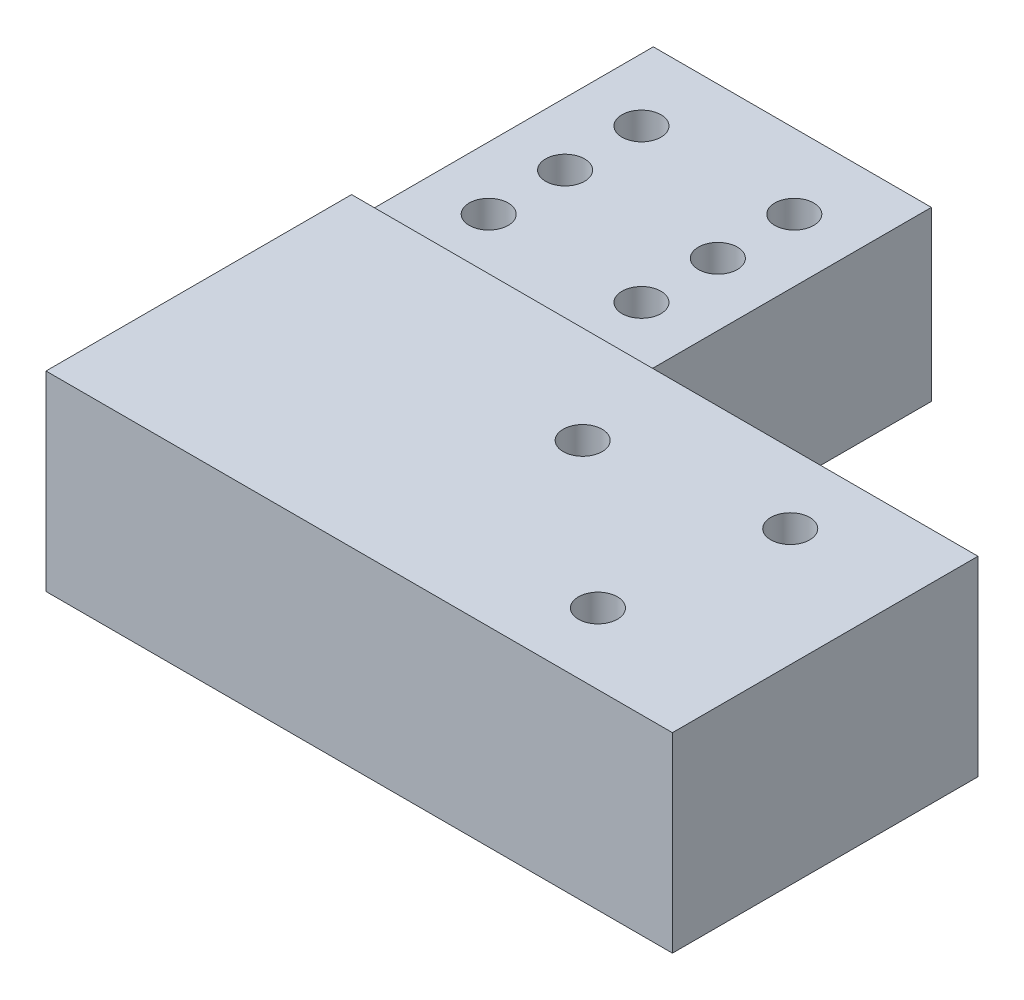
ISO-10303-21;
HEADER;
FILE_DESCRIPTION(('STEP AP214'),'2;1');
FILE_NAME('part.step','',(''),(''),'','','');
FILE_SCHEMA(('AUTOMOTIVE_DESIGN { 1 0 10303 214 1 1 1 1 }'));
ENDSEC;
DATA;
#1=APPLICATION_CONTEXT('core data for automotive mechanical design processes');
#2=APPLICATION_PROTOCOL_DEFINITION('international standard','automotive_design',2000,#1);
#3=PRODUCT_CONTEXT('',#1,'mechanical');
#4=PRODUCT('Part','Part','',(#3));
#5=PRODUCT_RELATED_PRODUCT_CATEGORY('part','',(#4));
#6=PRODUCT_DEFINITION_FORMATION('','',#4);
#7=PRODUCT_DEFINITION_CONTEXT('part definition',#1,'design');
#8=PRODUCT_DEFINITION('design','',#6,#7);
#9=PRODUCT_DEFINITION_SHAPE('','',#8);
#10=(LENGTH_UNIT() NAMED_UNIT(*) SI_UNIT(.MILLI.,.METRE.));
#11=(NAMED_UNIT(*) PLANE_ANGLE_UNIT() SI_UNIT($,.RADIAN.));
#12=(NAMED_UNIT(*) SI_UNIT($,.STERADIAN.) SOLID_ANGLE_UNIT());
#13=UNCERTAINTY_MEASURE_WITH_UNIT(LENGTH_MEASURE(1.E-05),#10,'distance_accuracy_value','');
#14=(GEOMETRIC_REPRESENTATION_CONTEXT(3) GLOBAL_UNCERTAINTY_ASSIGNED_CONTEXT((#13)) GLOBAL_UNIT_ASSIGNED_CONTEXT((#10,
#11,#12)) REPRESENTATION_CONTEXT('',''));
#15=CARTESIAN_POINT('',(0.,0.,0.));
#16=DIRECTION('',(0.,0.,1.));
#17=DIRECTION('',(1.,0.,0.));
#18=AXIS2_PLACEMENT_3D('',#15,#16,#17);
#19=CARTESIAN_POINT('',(0.,22.,0.));
#20=DIRECTION('',(0.,-1.,0.));
#21=DIRECTION('',(0.,0.,-1.));
#22=AXIS2_PLACEMENT_3D('',#19,#20,#21);
#23=PLANE('',#22);
#24=CARTESIAN_POINT('',(8.2,22.,29.75));
#25=DIRECTION('',(0.,-1.,0.));
#26=DIRECTION('',(0.,0.,-1.));
#27=AXIS2_PLACEMENT_3D('',#24,#25,#26);
#28=CIRCLE('',#27,2.55);
#29=CARTESIAN_POINT('',(8.2,22.,27.2));
#30=VERTEX_POINT('',#29);
#31=EDGE_CURVE('E125',#30,#30,#28,.T.);
#32=ORIENTED_EDGE('',*,*,#31,.T.);
#33=EDGE_LOOP('',(#32));
#34=FACE_BOUND('',#33,.T.);
#35=CARTESIAN_POINT('',(28.2,22.,29.75));
#36=DIRECTION('',(0.,-1.,0.));
#37=DIRECTION('',(0.,0.,-1.));
#38=AXIS2_PLACEMENT_3D('',#35,#36,#37);
#39=CIRCLE('',#38,2.55);
#40=CARTESIAN_POINT('',(28.2,22.,27.2));
#41=VERTEX_POINT('',#40);
#42=EDGE_CURVE('E132',#41,#41,#39,.T.);
#43=ORIENTED_EDGE('',*,*,#42,.T.);
#44=EDGE_LOOP('',(#43));
#45=FACE_BOUND('',#44,.T.);
#46=CARTESIAN_POINT('',(28.2000000000001,22.,19.75));
#47=DIRECTION('',(0.,-1.,0.));
#48=DIRECTION('',(0.,0.,-1.));
#49=AXIS2_PLACEMENT_3D('',#46,#47,#48);
#50=CIRCLE('',#49,2.55);
#51=CARTESIAN_POINT('',(28.2000000000001,22.,17.2));
#52=VERTEX_POINT('',#51);
#53=EDGE_CURVE('E137',#52,#52,#50,.T.);
#54=ORIENTED_EDGE('',*,*,#53,.T.);
#55=EDGE_LOOP('',(#54));
#56=FACE_BOUND('',#55,.T.);
#57=CARTESIAN_POINT('',(28.2000000000002,22.,9.75));
#58=DIRECTION('',(0.,-1.,0.));
#59=DIRECTION('',(0.,0.,-1.));
#60=AXIS2_PLACEMENT_3D('',#57,#58,#59);
#61=CIRCLE('',#60,2.55);
#62=CARTESIAN_POINT('',(28.2000000000002,22.,7.2));
#63=VERTEX_POINT('',#62);
#64=EDGE_CURVE('E143',#63,#63,#61,.T.);
#65=ORIENTED_EDGE('',*,*,#64,.T.);
#66=EDGE_LOOP('',(#65));
#67=FACE_BOUND('',#66,.T.);
#68=CARTESIAN_POINT('',(8.2000000000001,22.,19.75));
#69=DIRECTION('',(0.,-1.,0.));
#70=DIRECTION('',(0.,0.,-1.));
#71=AXIS2_PLACEMENT_3D('',#68,#69,#70);
#72=CIRCLE('',#71,2.55);
#73=CARTESIAN_POINT('',(8.2000000000001,22.,17.2));
#74=VERTEX_POINT('',#73);
#75=EDGE_CURVE('E149',#74,#74,#72,.T.);
#76=ORIENTED_EDGE('',*,*,#75,.T.);
#77=EDGE_LOOP('',(#76));
#78=FACE_BOUND('',#77,.T.);
#79=CARTESIAN_POINT('',(8.20000000000021,22.,9.75));
#80=DIRECTION('',(0.,-1.,0.));
#81=DIRECTION('',(0.,0.,-1.));
#82=AXIS2_PLACEMENT_3D('',#79,#80,#81);
#83=CIRCLE('',#82,2.55);
#84=CARTESIAN_POINT('',(8.20000000000021,22.,7.2));
#85=VERTEX_POINT('',#84);
#86=EDGE_CURVE('E155',#85,#85,#83,.T.);
#87=ORIENTED_EDGE('',*,*,#86,.T.);
#88=EDGE_LOOP('',(#87));
#89=FACE_BOUND('',#88,.T.);
#90=DIRECTION('',(1.,0.,0.));
#91=VECTOR('',#90,1.);
#92=CARTESIAN_POINT('',(0.,22.,0.));
#93=LINE('',#92,#91);
#94=CARTESIAN_POINT('',(0.,22.,0.));
#95=VERTEX_POINT('',#94);
#96=CARTESIAN_POINT('',(36.4,22.,0.));
#97=VERTEX_POINT('',#96);
#98=EDGE_CURVE('E54',#95,#97,#93,.T.);
#99=ORIENTED_EDGE('',*,*,#98,.F.);
#100=DIRECTION('',(0.,0.,1.));
#101=VECTOR('',#100,1.);
#102=CARTESIAN_POINT('',(0.,22.,0.));
#103=LINE('',#102,#101);
#104=CARTESIAN_POINT('',(0.,22.,39.5));
#105=VERTEX_POINT('',#104);
#106=EDGE_CURVE('E105',#95,#105,#103,.T.);
#107=ORIENTED_EDGE('',*,*,#106,.T.);
#108=DIRECTION('',(-1.,0.,0.));
#109=VECTOR('',#108,1.);
#110=CARTESIAN_POINT('',(0.,22.,39.5));
#111=LINE('',#110,#109);
#112=CARTESIAN_POINT('',(36.4,22.,39.5));
#113=VERTEX_POINT('',#112);
#114=EDGE_CURVE('E122',#113,#105,#111,.T.);
#115=ORIENTED_EDGE('',*,*,#114,.F.);
#116=DIRECTION('',(0.,0.,-1.));
#117=VECTOR('',#116,1.);
#118=CARTESIAN_POINT('',(36.4,22.,0.));
#119=LINE('',#118,#117);
#120=EDGE_CURVE('E48',#113,#97,#119,.T.);
#121=ORIENTED_EDGE('',*,*,#120,.T.);
#122=EDGE_LOOP('',(#99,#107,#115,#121));
#123=FACE_BOUND('',#122,.T.);
#124=ADVANCED_FACE('F40',(#34,#45,#56,#67,#78,#89,#123),#23,.F.);
#125=CARTESIAN_POINT('',(0.,0.,0.));
#126=DIRECTION('',(0.,-1.,0.));
#127=DIRECTION('',(0.,0.,-1.));
#128=AXIS2_PLACEMENT_3D('',#125,#126,#127);
#129=PLANE('',#128);
#130=CARTESIAN_POINT('',(8.2,0.,29.75));
#131=DIRECTION('',(0.,-1.,0.));
#132=DIRECTION('',(0.,0.,-1.));
#133=AXIS2_PLACEMENT_3D('',#130,#131,#132);
#134=CIRCLE('',#133,2.55);
#135=CARTESIAN_POINT('',(8.2,0.,27.2));
#136=VERTEX_POINT('',#135);
#137=EDGE_CURVE('E128',#136,#136,#134,.T.);
#138=ORIENTED_EDGE('',*,*,#137,.F.);
#139=EDGE_LOOP('',(#138));
#140=FACE_BOUND('',#139,.T.);
#141=CARTESIAN_POINT('',(28.2,0.,29.75));
#142=DIRECTION('',(0.,-1.,0.));
#143=DIRECTION('',(0.,0.,-1.));
#144=AXIS2_PLACEMENT_3D('',#141,#142,#143);
#145=CIRCLE('',#144,2.55);
#146=CARTESIAN_POINT('',(28.2,0.,27.2));
#147=VERTEX_POINT('',#146);
#148=EDGE_CURVE('E134',#147,#147,#145,.T.);
#149=ORIENTED_EDGE('',*,*,#148,.F.);
#150=EDGE_LOOP('',(#149));
#151=FACE_BOUND('',#150,.T.);
#152=CARTESIAN_POINT('',(28.2000000000001,0.,19.75));
#153=DIRECTION('',(0.,-1.,0.));
#154=DIRECTION('',(0.,0.,-1.));
#155=AXIS2_PLACEMENT_3D('',#152,#153,#154);
#156=CIRCLE('',#155,2.55);
#157=CARTESIAN_POINT('',(28.2000000000001,0.,17.2));
#158=VERTEX_POINT('',#157);
#159=EDGE_CURVE('E140',#158,#158,#156,.T.);
#160=ORIENTED_EDGE('',*,*,#159,.F.);
#161=EDGE_LOOP('',(#160));
#162=FACE_BOUND('',#161,.T.);
#163=CARTESIAN_POINT('',(28.2000000000002,0.,9.75));
#164=DIRECTION('',(0.,-1.,0.));
#165=DIRECTION('',(0.,0.,-1.));
#166=AXIS2_PLACEMENT_3D('',#163,#164,#165);
#167=CIRCLE('',#166,2.55);
#168=CARTESIAN_POINT('',(28.2000000000002,0.,7.2));
#169=VERTEX_POINT('',#168);
#170=EDGE_CURVE('E146',#169,#169,#167,.T.);
#171=ORIENTED_EDGE('',*,*,#170,.F.);
#172=EDGE_LOOP('',(#171));
#173=FACE_BOUND('',#172,.T.);
#174=CARTESIAN_POINT('',(8.2000000000001,0.,19.75));
#175=DIRECTION('',(0.,-1.,0.));
#176=DIRECTION('',(0.,0.,-1.));
#177=AXIS2_PLACEMENT_3D('',#174,#175,#176);
#178=CIRCLE('',#177,2.55);
#179=CARTESIAN_POINT('',(8.2000000000001,0.,17.2));
#180=VERTEX_POINT('',#179);
#181=EDGE_CURVE('E152',#180,#180,#178,.T.);
#182=ORIENTED_EDGE('',*,*,#181,.F.);
#183=EDGE_LOOP('',(#182));
#184=FACE_BOUND('',#183,.T.);
#185=CARTESIAN_POINT('',(8.20000000000021,0.,9.75));
#186=DIRECTION('',(0.,-1.,0.));
#187=DIRECTION('',(0.,0.,-1.));
#188=AXIS2_PLACEMENT_3D('',#185,#186,#187);
#189=CIRCLE('',#188,2.55);
#190=CARTESIAN_POINT('',(8.20000000000021,0.,7.2));
#191=VERTEX_POINT('',#190);
#192=EDGE_CURVE('E158',#191,#191,#189,.T.);
#193=ORIENTED_EDGE('',*,*,#192,.F.);
#194=EDGE_LOOP('',(#193));
#195=FACE_BOUND('',#194,.T.);
#196=CARTESIAN_POINT('',(66.5818867463413,0.,48.6598805720561));
#197=DIRECTION('',(0.,1.,0.));
#198=DIRECTION('',(0.,0.,1.));
#199=AXIS2_PLACEMENT_3D('',#196,#197,#198);
#200=CIRCLE('',#199,2.55);
#201=CARTESIAN_POINT('',(66.5818867463413,0.,51.2098805720561));
#202=VERTEX_POINT('',#201);
#203=EDGE_CURVE('E190',#202,#202,#200,.T.);
#204=ORIENTED_EDGE('',*,*,#203,.T.);
#205=EDGE_LOOP('',(#204));
#206=FACE_BOUND('',#205,.T.);
#207=CARTESIAN_POINT('',(62.9961003087144,0.,70.245667009683));
#208=DIRECTION('',(0.,1.,0.));
#209=DIRECTION('',(0.,0.,1.));
#210=AXIS2_PLACEMENT_3D('',#207,#208,#209);
#211=CIRCLE('',#210,2.55);
#212=CARTESIAN_POINT('',(62.9961003087144,0.,72.795667009683));
#213=VERTEX_POINT('',#212);
#214=EDGE_CURVE('E196',#213,#213,#211,.T.);
#215=ORIENTED_EDGE('',*,*,#214,.T.);
#216=EDGE_LOOP('',(#215));
#217=FACE_BOUND('',#216,.T.);
#218=CARTESIAN_POINT('',(42.9961003087144,0.,52.245667009683));
#219=DIRECTION('',(0.,1.,0.));
#220=DIRECTION('',(0.,0.,1.));
#221=AXIS2_PLACEMENT_3D('',#218,#219,#220);
#222=CIRCLE('',#221,2.55);
#223=CARTESIAN_POINT('',(42.9961003087144,0.,54.795667009683));
#224=VERTEX_POINT('',#223);
#225=EDGE_CURVE('E202',#224,#224,#222,.T.);
#226=ORIENTED_EDGE('',*,*,#225,.T.);
#227=EDGE_LOOP('',(#226));
#228=FACE_BOUND('',#227,.T.);
#229=DIRECTION('',(0.,0.,1.));
#230=VECTOR('',#229,1.);
#231=CARTESIAN_POINT('',(0.,0.,0.));
#232=LINE('',#231,#230);
#233=CARTESIAN_POINT('',(0.,0.,0.));
#234=VERTEX_POINT('',#233);
#235=CARTESIAN_POINT('',(0.,0.,79.5));
#236=VERTEX_POINT('',#235);
#237=EDGE_CURVE('E116',#234,#236,#232,.T.);
#238=ORIENTED_EDGE('',*,*,#237,.F.);
#239=DIRECTION('',(1.,0.,0.));
#240=VECTOR('',#239,1.);
#241=CARTESIAN_POINT('',(0.,0.,0.));
#242=LINE('',#241,#240);
#243=CARTESIAN_POINT('',(36.4,0.,0.));
#244=VERTEX_POINT('',#243);
#245=EDGE_CURVE('E99',#234,#244,#242,.T.);
#246=ORIENTED_EDGE('',*,*,#245,.T.);
#247=DIRECTION('',(0.,0.,-1.));
#248=VECTOR('',#247,1.);
#249=CARTESIAN_POINT('',(36.4,0.,0.));
#250=LINE('',#249,#248);
#251=CARTESIAN_POINT('',(36.4,0.,39.5));
#252=VERTEX_POINT('',#251);
#253=EDGE_CURVE('E112',#252,#244,#250,.T.);
#254=ORIENTED_EDGE('',*,*,#253,.F.);
#255=DIRECTION('',(1.,0.,0.));
#256=VECTOR('',#255,1.);
#257=CARTESIAN_POINT('',(0.,0.,39.5));
#258=LINE('',#257,#256);
#259=CARTESIAN_POINT('',(82.,0.,39.5));
#260=VERTEX_POINT('',#259);
#261=EDGE_CURVE('E182',#252,#260,#258,.T.);
#262=ORIENTED_EDGE('',*,*,#261,.T.);
#263=DIRECTION('',(0.,0.,1.));
#264=VECTOR('',#263,1.);
#265=CARTESIAN_POINT('',(82.,0.,39.5));
#266=LINE('',#265,#264);
#267=CARTESIAN_POINT('',(82.,0.,79.5));
#268=VERTEX_POINT('',#267);
#269=EDGE_CURVE('E184',#260,#268,#266,.T.);
#270=ORIENTED_EDGE('',*,*,#269,.T.);
#271=DIRECTION('',(-1.,0.,0.));
#272=VECTOR('',#271,1.);
#273=CARTESIAN_POINT('',(0.,0.,79.5));
#274=LINE('',#273,#272);
#275=EDGE_CURVE('E187',#268,#236,#274,.T.);
#276=ORIENTED_EDGE('',*,*,#275,.T.);
#277=EDGE_LOOP('',(#238,#246,#254,#262,#270,#276));
#278=FACE_BOUND('',#277,.T.);
#279=ADVANCED_FACE('F208',(#140,#151,#162,#173,#184,#195,#206,#217,#228,#278),#129,.T.);
#280=CARTESIAN_POINT('',(0.,22.,0.));
#281=DIRECTION('',(1.,0.,0.));
#282=DIRECTION('',(0.,0.,-1.));
#283=AXIS2_PLACEMENT_3D('',#280,#281,#282);
#284=PLANE('',#283);
#285=DIRECTION('',(0.,-1.,0.));
#286=VECTOR('',#285,1.);
#287=CARTESIAN_POINT('',(0.,52.,0.));
#288=LINE('',#287,#286);
#289=EDGE_CURVE('E96',#95,#234,#288,.T.);
#290=ORIENTED_EDGE('',*,*,#289,.T.);
#291=ORIENTED_EDGE('',*,*,#237,.T.);
#292=DIRECTION('',(0.,-1.,0.));
#293=VECTOR('',#292,1.);
#294=CARTESIAN_POINT('',(0.,25.,79.5));
#295=LINE('',#294,#293);
#296=CARTESIAN_POINT('',(0.,25.,79.5));
#297=VERTEX_POINT('',#296);
#298=EDGE_CURVE('E161',#297,#236,#295,.T.);
#299=ORIENTED_EDGE('',*,*,#298,.F.);
#300=DIRECTION('',(0.,0.,-1.));
#301=VECTOR('',#300,1.);
#302=CARTESIAN_POINT('',(0.,25.,39.5));
#303=LINE('',#302,#301);
#304=CARTESIAN_POINT('',(0.,25.,39.5));
#305=VERTEX_POINT('',#304);
#306=EDGE_CURVE('E180',#297,#305,#303,.T.);
#307=ORIENTED_EDGE('',*,*,#306,.T.);
#308=DIRECTION('',(0.,-1.,0.));
#309=VECTOR('',#308,1.);
#310=CARTESIAN_POINT('',(0.,25.,39.5));
#311=LINE('',#310,#309);
#312=EDGE_CURVE('E111',#305,#105,#311,.T.);
#313=ORIENTED_EDGE('',*,*,#312,.T.);
#314=ORIENTED_EDGE('',*,*,#106,.F.);
#315=EDGE_LOOP('',(#290,#291,#299,#307,#313,#314));
#316=FACE_BOUND('',#315,.T.);
#317=ADVANCED_FACE('F42',(#316),#284,.F.);
#318=CARTESIAN_POINT('',(36.4,22.,0.));
#319=DIRECTION('',(-1.,0.,0.));
#320=DIRECTION('',(0.,0.,1.));
#321=AXIS2_PLACEMENT_3D('',#318,#319,#320);
#322=PLANE('',#321);
#323=DIRECTION('',(0.,-1.,0.));
#324=VECTOR('',#323,1.);
#325=CARTESIAN_POINT('',(36.4,22.,0.));
#326=LINE('',#325,#324);
#327=EDGE_CURVE('E11',#97,#244,#326,.T.);
#328=ORIENTED_EDGE('',*,*,#327,.F.);
#329=ORIENTED_EDGE('',*,*,#120,.F.);
#330=DIRECTION('',(0.,-1.,0.));
#331=VECTOR('',#330,1.);
#332=CARTESIAN_POINT('',(36.4,22.,39.5));
#333=LINE('',#332,#331);
#334=EDGE_CURVE('E118',#113,#252,#333,.T.);
#335=ORIENTED_EDGE('',*,*,#334,.T.);
#336=ORIENTED_EDGE('',*,*,#253,.T.);
#337=EDGE_LOOP('',(#328,#329,#335,#336));
#338=FACE_BOUND('',#337,.T.);
#339=ADVANCED_FACE('F209',(#338),#322,.F.);
#340=CARTESIAN_POINT('',(8.2,22.,29.75));
#341=DIRECTION('',(0.,-1.,0.));
#342=DIRECTION('',(0.,0.,-1.));
#343=AXIS2_PLACEMENT_3D('',#340,#341,#342);
#344=CYLINDRICAL_SURFACE('',#343,2.55);
#345=ORIENTED_EDGE('',*,*,#31,.F.);
#346=EDGE_LOOP('',(#345));
#347=FACE_BOUND('',#346,.T.);
#348=ORIENTED_EDGE('',*,*,#137,.T.);
#349=EDGE_LOOP('',(#348));
#350=FACE_BOUND('',#349,.T.);
#351=ADVANCED_FACE('F211',(#347,#350),#344,.F.);
#352=CARTESIAN_POINT('',(28.2,22.,29.75));
#353=DIRECTION('',(0.,-1.,0.));
#354=DIRECTION('',(0.,0.,-1.));
#355=AXIS2_PLACEMENT_3D('',#352,#353,#354);
#356=CYLINDRICAL_SURFACE('',#355,2.55);
#357=ORIENTED_EDGE('',*,*,#42,.F.);
#358=EDGE_LOOP('',(#357));
#359=FACE_BOUND('',#358,.T.);
#360=ORIENTED_EDGE('',*,*,#148,.T.);
#361=EDGE_LOOP('',(#360));
#362=FACE_BOUND('',#361,.T.);
#363=ADVANCED_FACE('F216',(#359,#362),#356,.F.);
#364=CARTESIAN_POINT('',(28.2000000000001,22.,19.75));
#365=DIRECTION('',(0.,-1.,0.));
#366=DIRECTION('',(0.,0.,-1.));
#367=AXIS2_PLACEMENT_3D('',#364,#365,#366);
#368=CYLINDRICAL_SURFACE('',#367,2.55);
#369=ORIENTED_EDGE('',*,*,#53,.F.);
#370=EDGE_LOOP('',(#369));
#371=FACE_BOUND('',#370,.T.);
#372=ORIENTED_EDGE('',*,*,#159,.T.);
#373=EDGE_LOOP('',(#372));
#374=FACE_BOUND('',#373,.T.);
#375=ADVANCED_FACE('F231',(#371,#374),#368,.F.);
#376=CARTESIAN_POINT('',(28.2000000000002,22.,9.75));
#377=DIRECTION('',(0.,-1.,0.));
#378=DIRECTION('',(0.,0.,-1.));
#379=AXIS2_PLACEMENT_3D('',#376,#377,#378);
#380=CYLINDRICAL_SURFACE('',#379,2.55);
#381=ORIENTED_EDGE('',*,*,#64,.F.);
#382=EDGE_LOOP('',(#381));
#383=FACE_BOUND('',#382,.T.);
#384=ORIENTED_EDGE('',*,*,#170,.T.);
#385=EDGE_LOOP('',(#384));
#386=FACE_BOUND('',#385,.T.);
#387=ADVANCED_FACE('F235',(#383,#386),#380,.F.);
#388=CARTESIAN_POINT('',(8.2000000000001,22.,19.75));
#389=DIRECTION('',(0.,-1.,0.));
#390=DIRECTION('',(0.,0.,-1.));
#391=AXIS2_PLACEMENT_3D('',#388,#389,#390);
#392=CYLINDRICAL_SURFACE('',#391,2.55);
#393=ORIENTED_EDGE('',*,*,#75,.F.);
#394=EDGE_LOOP('',(#393));
#395=FACE_BOUND('',#394,.T.);
#396=ORIENTED_EDGE('',*,*,#181,.T.);
#397=EDGE_LOOP('',(#396));
#398=FACE_BOUND('',#397,.T.);
#399=ADVANCED_FACE('F239',(#395,#398),#392,.F.);
#400=CARTESIAN_POINT('',(8.20000000000021,22.,9.75));
#401=DIRECTION('',(0.,-1.,0.));
#402=DIRECTION('',(0.,0.,-1.));
#403=AXIS2_PLACEMENT_3D('',#400,#401,#402);
#404=CYLINDRICAL_SURFACE('',#403,2.55);
#405=ORIENTED_EDGE('',*,*,#86,.F.);
#406=EDGE_LOOP('',(#405));
#407=FACE_BOUND('',#406,.T.);
#408=ORIENTED_EDGE('',*,*,#192,.T.);
#409=EDGE_LOOP('',(#408));
#410=FACE_BOUND('',#409,.T.);
#411=ADVANCED_FACE('F243',(#407,#410),#404,.F.);
#412=CARTESIAN_POINT('',(0.,25.,39.5));
#413=DIRECTION('',(0.,0.,-1.));
#414=DIRECTION('',(-1.,0.,0.));
#415=AXIS2_PLACEMENT_3D('',#412,#413,#414);
#416=PLANE('',#415);
#417=ORIENTED_EDGE('',*,*,#334,.F.);
#418=ORIENTED_EDGE('',*,*,#114,.T.);
#419=ORIENTED_EDGE('',*,*,#312,.F.);
#420=DIRECTION('',(1.,0.,0.));
#421=VECTOR('',#420,1.);
#422=CARTESIAN_POINT('',(0.,25.,39.5));
#423=LINE('',#422,#421);
#424=CARTESIAN_POINT('',(82.,25.,39.5));
#425=VERTEX_POINT('',#424);
#426=EDGE_CURVE('E171',#305,#425,#423,.T.);
#427=ORIENTED_EDGE('',*,*,#426,.T.);
#428=DIRECTION('',(0.,-1.,0.));
#429=VECTOR('',#428,1.);
#430=CARTESIAN_POINT('',(82.,25.,39.5));
#431=LINE('',#430,#429);
#432=EDGE_CURVE('E167',#425,#260,#431,.T.);
#433=ORIENTED_EDGE('',*,*,#432,.T.);
#434=ORIENTED_EDGE('',*,*,#261,.F.);
#435=EDGE_LOOP('',(#417,#418,#419,#427,#433,#434));
#436=FACE_BOUND('',#435,.T.);
#437=ADVANCED_FACE('F247',(#436),#416,.T.);
#438=CARTESIAN_POINT('',(0.,25.,79.5));
#439=DIRECTION('',(0.,0.,1.));
#440=DIRECTION('',(1.,0.,0.));
#441=AXIS2_PLACEMENT_3D('',#438,#439,#440);
#442=PLANE('',#441);
#443=ORIENTED_EDGE('',*,*,#298,.T.);
#444=ORIENTED_EDGE('',*,*,#275,.F.);
#445=DIRECTION('',(0.,-1.,0.));
#446=VECTOR('',#445,1.);
#447=CARTESIAN_POINT('',(82.,25.,79.5));
#448=LINE('',#447,#446);
#449=CARTESIAN_POINT('',(82.,25.,79.5));
#450=VERTEX_POINT('',#449);
#451=EDGE_CURVE('E165',#450,#268,#448,.T.);
#452=ORIENTED_EDGE('',*,*,#451,.F.);
#453=DIRECTION('',(-1.,0.,0.));
#454=VECTOR('',#453,1.);
#455=CARTESIAN_POINT('',(0.,25.,79.5));
#456=LINE('',#455,#454);
#457=EDGE_CURVE('E177',#450,#297,#456,.T.);
#458=ORIENTED_EDGE('',*,*,#457,.T.);
#459=EDGE_LOOP('',(#443,#444,#452,#458));
#460=FACE_BOUND('',#459,.T.);
#461=ADVANCED_FACE('F249',(#460),#442,.T.);
#462=CARTESIAN_POINT('',(82.,25.,39.5));
#463=DIRECTION('',(1.,0.,0.));
#464=DIRECTION('',(0.,0.,-1.));
#465=AXIS2_PLACEMENT_3D('',#462,#463,#464);
#466=PLANE('',#465);
#467=ORIENTED_EDGE('',*,*,#451,.T.);
#468=ORIENTED_EDGE('',*,*,#269,.F.);
#469=ORIENTED_EDGE('',*,*,#432,.F.);
#470=DIRECTION('',(0.,0.,1.));
#471=VECTOR('',#470,1.);
#472=CARTESIAN_POINT('',(82.,25.,39.5));
#473=LINE('',#472,#471);
#474=EDGE_CURVE('E174',#425,#450,#473,.T.);
#475=ORIENTED_EDGE('',*,*,#474,.T.);
#476=EDGE_LOOP('',(#467,#468,#469,#475));
#477=FACE_BOUND('',#476,.T.);
#478=ADVANCED_FACE('F252',(#477),#466,.T.);
#479=CARTESIAN_POINT('',(0.,25.,0.));
#480=DIRECTION('',(0.,-1.,0.));
#481=DIRECTION('',(0.,0.,1.));
#482=AXIS2_PLACEMENT_3D('',#479,#480,#481);
#483=PLANE('',#482);
#484=CARTESIAN_POINT('',(42.9961003087144,25.,52.245667009683));
#485=DIRECTION('',(0.,1.,0.));
#486=DIRECTION('',(0.,0.,1.));
#487=AXIS2_PLACEMENT_3D('',#484,#485,#486);
#488=CIRCLE('',#487,2.55);
#489=CARTESIAN_POINT('',(42.9961003087144,25.,54.795667009683));
#490=VERTEX_POINT('',#489);
#491=EDGE_CURVE('E107',#490,#490,#488,.T.);
#492=ORIENTED_EDGE('',*,*,#491,.F.);
#493=EDGE_LOOP('',(#492));
#494=FACE_BOUND('',#493,.T.);
#495=CARTESIAN_POINT('',(62.9961003087144,25.,70.245667009683));
#496=DIRECTION('',(0.,1.,0.));
#497=DIRECTION('',(0.,0.,1.));
#498=AXIS2_PLACEMENT_3D('',#495,#496,#497);
#499=CIRCLE('',#498,2.55);
#500=CARTESIAN_POINT('',(62.9961003087144,25.,72.795667009683));
#501=VERTEX_POINT('',#500);
#502=EDGE_CURVE('E199',#501,#501,#499,.T.);
#503=ORIENTED_EDGE('',*,*,#502,.F.);
#504=EDGE_LOOP('',(#503));
#505=FACE_BOUND('',#504,.T.);
#506=CARTESIAN_POINT('',(66.5818867463413,25.,48.6598805720561));
#507=DIRECTION('',(0.,1.,0.));
#508=DIRECTION('',(0.,0.,1.));
#509=AXIS2_PLACEMENT_3D('',#506,#507,#508);
#510=CIRCLE('',#509,2.55);
#511=CARTESIAN_POINT('',(66.5818867463413,25.,51.2098805720561));
#512=VERTEX_POINT('',#511);
#513=EDGE_CURVE('E193',#512,#512,#510,.T.);
#514=ORIENTED_EDGE('',*,*,#513,.F.);
#515=EDGE_LOOP('',(#514));
#516=FACE_BOUND('',#515,.T.);
#517=ORIENTED_EDGE('',*,*,#306,.F.);
#518=ORIENTED_EDGE('',*,*,#457,.F.);
#519=ORIENTED_EDGE('',*,*,#474,.F.);
#520=ORIENTED_EDGE('',*,*,#426,.F.);
#521=EDGE_LOOP('',(#517,#518,#519,#520));
#522=FACE_BOUND('',#521,.T.);
#523=ADVANCED_FACE('F256',(#494,#505,#516,#522),#483,.F.);
#524=CARTESIAN_POINT('',(66.5818867463413,25.,48.6598805720561));
#525=DIRECTION('',(0.,1.,0.));
#526=DIRECTION('',(0.,0.,1.));
#527=AXIS2_PLACEMENT_3D('',#524,#525,#526);
#528=CYLINDRICAL_SURFACE('',#527,2.55);
#529=ORIENTED_EDGE('',*,*,#203,.F.);
#530=EDGE_LOOP('',(#529));
#531=FACE_BOUND('',#530,.T.);
#532=ORIENTED_EDGE('',*,*,#513,.T.);
#533=EDGE_LOOP('',(#532));
#534=FACE_BOUND('',#533,.T.);
#535=ADVANCED_FACE('F262',(#531,#534),#528,.F.);
#536=CARTESIAN_POINT('',(62.9961003087144,25.,70.245667009683));
#537=DIRECTION('',(0.,1.,0.));
#538=DIRECTION('',(0.,0.,1.));
#539=AXIS2_PLACEMENT_3D('',#536,#537,#538);
#540=CYLINDRICAL_SURFACE('',#539,2.55);
#541=ORIENTED_EDGE('',*,*,#214,.F.);
#542=EDGE_LOOP('',(#541));
#543=FACE_BOUND('',#542,.T.);
#544=ORIENTED_EDGE('',*,*,#502,.T.);
#545=EDGE_LOOP('',(#544));
#546=FACE_BOUND('',#545,.T.);
#547=ADVANCED_FACE('F266',(#543,#546),#540,.F.);
#548=CARTESIAN_POINT('',(42.9961003087144,25.,52.245667009683));
#549=DIRECTION('',(0.,1.,0.));
#550=DIRECTION('',(0.,0.,1.));
#551=AXIS2_PLACEMENT_3D('',#548,#549,#550);
#552=CYLINDRICAL_SURFACE('',#551,2.55);
#553=ORIENTED_EDGE('',*,*,#225,.F.);
#554=EDGE_LOOP('',(#553));
#555=FACE_BOUND('',#554,.T.);
#556=ORIENTED_EDGE('',*,*,#491,.T.);
#557=EDGE_LOOP('',(#556));
#558=FACE_BOUND('',#557,.T.);
#559=ADVANCED_FACE('F270',(#555,#558),#552,.F.);
#560=CARTESIAN_POINT('',(0.,52.,0.));
#561=DIRECTION('',(0.,0.,-1.));
#562=DIRECTION('',(-1.,0.,0.));
#563=AXIS2_PLACEMENT_3D('',#560,#561,#562);
#564=PLANE('',#563);
#565=ORIENTED_EDGE('',*,*,#98,.T.);
#566=ORIENTED_EDGE('',*,*,#327,.T.);
#567=ORIENTED_EDGE('',*,*,#245,.F.);
#568=ORIENTED_EDGE('',*,*,#289,.F.);
#569=EDGE_LOOP('',(#565,#566,#567,#568));
#570=FACE_BOUND('',#569,.T.);
#571=ADVANCED_FACE('F97',(#570),#564,.T.);
#572=CLOSED_SHELL('',(#124,#279,#317,#339,#351,#363,#375,#387,#399,#411,#437,#461,#478,#523,
#535,#547,#559,#571));
#573=MANIFOLD_SOLID_BREP('B2',#572);
#574=ADVANCED_BREP_SHAPE_REPRESENTATION('',(#18,#573),#14);
#575=SHAPE_DEFINITION_REPRESENTATION(#9,#574);
ENDSEC;
END-ISO-10303-21;
